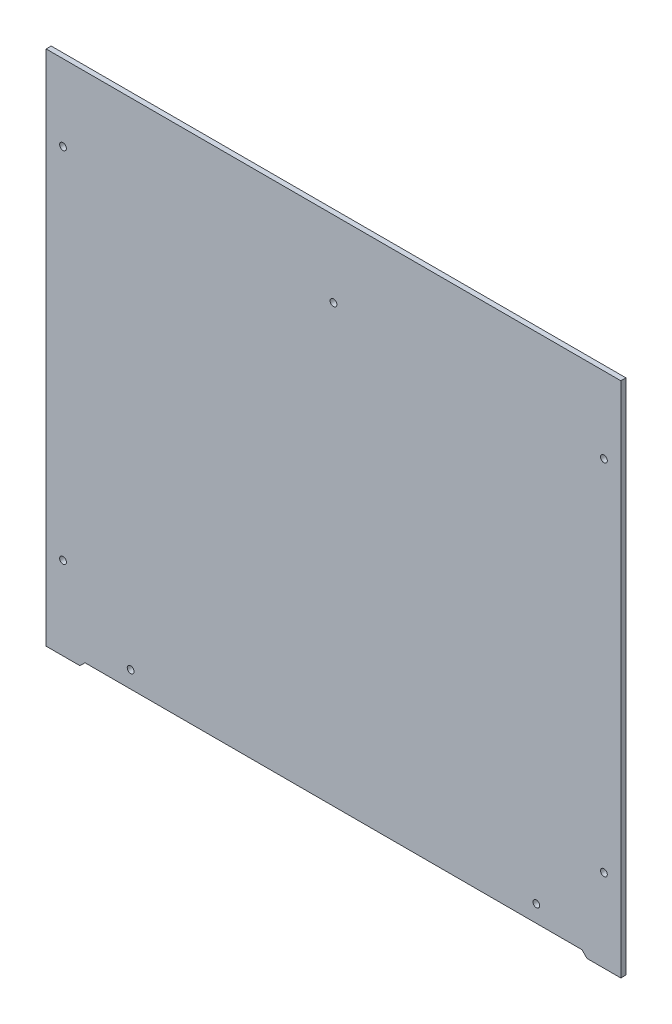
ISO-10303-21;
HEADER;
FILE_DESCRIPTION(('STEP AP214'),'2;1');
FILE_NAME('part.step','',(''),(''),'','','');
FILE_SCHEMA(('AUTOMOTIVE_DESIGN { 1 0 10303 214 1 1 1 1 }'));
ENDSEC;
DATA;
#1=APPLICATION_CONTEXT('core data for automotive mechanical design processes');
#2=APPLICATION_PROTOCOL_DEFINITION('international standard','automotive_design',2000,#1);
#3=PRODUCT_CONTEXT('',#1,'mechanical');
#4=PRODUCT('Part','Part','',(#3));
#5=PRODUCT_RELATED_PRODUCT_CATEGORY('part','',(#4));
#6=PRODUCT_DEFINITION_FORMATION('','',#4);
#7=PRODUCT_DEFINITION_CONTEXT('part definition',#1,'design');
#8=PRODUCT_DEFINITION('design','',#6,#7);
#9=PRODUCT_DEFINITION_SHAPE('','',#8);
#10=(LENGTH_UNIT() NAMED_UNIT(*) SI_UNIT(.MILLI.,.METRE.));
#11=(NAMED_UNIT(*) PLANE_ANGLE_UNIT() SI_UNIT($,.RADIAN.));
#12=(NAMED_UNIT(*) SI_UNIT($,.STERADIAN.) SOLID_ANGLE_UNIT());
#13=UNCERTAINTY_MEASURE_WITH_UNIT(LENGTH_MEASURE(1.E-05),#10,'distance_accuracy_value','');
#14=(GEOMETRIC_REPRESENTATION_CONTEXT(3) GLOBAL_UNCERTAINTY_ASSIGNED_CONTEXT((#13)) GLOBAL_UNIT_ASSIGNED_CONTEXT((#10,
#11,#12)) REPRESENTATION_CONTEXT('',''));
#15=CARTESIAN_POINT('',(0.,0.,0.));
#16=DIRECTION('',(0.,0.,1.));
#17=DIRECTION('',(1.,0.,0.));
#18=AXIS2_PLACEMENT_3D('',#15,#16,#17);
#19=CARTESIAN_POINT('',(0.,151.5,3.));
#20=DIRECTION('',(0.,-1.,0.));
#21=DIRECTION('',(1.,0.,0.));
#22=AXIS2_PLACEMENT_3D('',#19,#20,#21);
#23=PLANE('',#22);
#24=DIRECTION('',(-1.,0.,0.));
#25=VECTOR('',#24,1.);
#26=CARTESIAN_POINT('',(0.,151.5,0.));
#27=LINE('',#26,#25);
#28=CARTESIAN_POINT('',(170.,151.5,0.));
#29=VERTEX_POINT('',#28);
#30=CARTESIAN_POINT('',(-170.,151.5,0.));
#31=VERTEX_POINT('',#30);
#32=EDGE_CURVE('E159',#29,#31,#27,.T.);
#33=ORIENTED_EDGE('',*,*,#32,.T.);
#34=DIRECTION('',(0.,0.,-1.));
#35=VECTOR('',#34,1.);
#36=CARTESIAN_POINT('',(-170.,151.5,3.));
#37=LINE('',#36,#35);
#38=CARTESIAN_POINT('',(-170.,151.5,3.));
#39=VERTEX_POINT('',#38);
#40=EDGE_CURVE('E11',#39,#31,#37,.T.);
#41=ORIENTED_EDGE('',*,*,#40,.F.);
#42=DIRECTION('',(-1.,0.,0.));
#43=VECTOR('',#42,1.);
#44=CARTESIAN_POINT('',(0.,151.5,3.));
#45=LINE('',#44,#43);
#46=CARTESIAN_POINT('',(170.,151.5,3.));
#47=VERTEX_POINT('',#46);
#48=EDGE_CURVE('E211',#47,#39,#45,.T.);
#49=ORIENTED_EDGE('',*,*,#48,.F.);
#50=DIRECTION('',(0.,0.,-1.));
#51=VECTOR('',#50,1.);
#52=CARTESIAN_POINT('',(170.,151.5,3.));
#53=LINE('',#52,#51);
#54=EDGE_CURVE('E57',#47,#29,#53,.T.);
#55=ORIENTED_EDGE('',*,*,#54,.T.);
#56=EDGE_LOOP('',(#33,#41,#49,#55));
#57=FACE_BOUND('',#56,.T.);
#58=ADVANCED_FACE('F40',(#57),#23,.F.);
#59=CARTESIAN_POINT('',(-170.,0.,3.));
#60=DIRECTION('',(1.,0.,0.));
#61=DIRECTION('',(0.,0.,-1.));
#62=AXIS2_PLACEMENT_3D('',#59,#60,#61);
#63=PLANE('',#62);
#64=DIRECTION('',(0.,-1.,0.));
#65=VECTOR('',#64,1.);
#66=CARTESIAN_POINT('',(-170.,0.,0.));
#67=LINE('',#66,#65);
#68=CARTESIAN_POINT('',(-170.,-154.5,0.));
#69=VERTEX_POINT('',#68);
#70=EDGE_CURVE('E161',#31,#69,#67,.T.);
#71=ORIENTED_EDGE('',*,*,#70,.T.);
#72=DIRECTION('',(0.,0.,-1.));
#73=VECTOR('',#72,1.);
#74=CARTESIAN_POINT('',(-170.,-154.5,3.));
#75=LINE('',#74,#73);
#76=CARTESIAN_POINT('',(-170.,-154.5,3.));
#77=VERTEX_POINT('',#76);
#78=EDGE_CURVE('E49',#77,#69,#75,.T.);
#79=ORIENTED_EDGE('',*,*,#78,.F.);
#80=DIRECTION('',(0.,-1.,0.));
#81=VECTOR('',#80,1.);
#82=CARTESIAN_POINT('',(-170.,0.,3.));
#83=LINE('',#82,#81);
#84=EDGE_CURVE('E95',#39,#77,#83,.T.);
#85=ORIENTED_EDGE('',*,*,#84,.F.);
#86=ORIENTED_EDGE('',*,*,#40,.T.);
#87=EDGE_LOOP('',(#71,#79,#85,#86));
#88=FACE_BOUND('',#87,.T.);
#89=ADVANCED_FACE('F196',(#88),#63,.F.);
#90=CARTESIAN_POINT('',(0.,-154.5,3.));
#91=DIRECTION('',(0.,-1.,0.));
#92=DIRECTION('',(0.,0.,-1.));
#93=AXIS2_PLACEMENT_3D('',#90,#91,#92);
#94=PLANE('',#93);
#95=DIRECTION('',(-1.,0.,0.));
#96=VECTOR('',#95,1.);
#97=CARTESIAN_POINT('',(0.,-154.5,0.));
#98=LINE('',#97,#96);
#99=CARTESIAN_POINT('',(-150.,-154.5,0.));
#100=VERTEX_POINT('',#99);
#101=EDGE_CURVE('E165',#100,#69,#98,.T.);
#102=ORIENTED_EDGE('',*,*,#101,.F.);
#103=DIRECTION('',(0.,0.,-1.));
#104=VECTOR('',#103,1.);
#105=CARTESIAN_POINT('',(-150.,-154.5,3.));
#106=LINE('',#105,#104);
#107=CARTESIAN_POINT('',(-150.,-154.5,3.));
#108=VERTEX_POINT('',#107);
#109=EDGE_CURVE('E189',#108,#100,#106,.T.);
#110=ORIENTED_EDGE('',*,*,#109,.F.);
#111=DIRECTION('',(-1.,0.,0.));
#112=VECTOR('',#111,1.);
#113=CARTESIAN_POINT('',(0.,-154.5,3.));
#114=LINE('',#113,#112);
#115=EDGE_CURVE('E195',#108,#77,#114,.T.);
#116=ORIENTED_EDGE('',*,*,#115,.T.);
#117=ORIENTED_EDGE('',*,*,#78,.T.);
#118=EDGE_LOOP('',(#102,#110,#116,#117));
#119=FACE_BOUND('',#118,.T.);
#120=ADVANCED_FACE('F193',(#119),#94,.T.);
#121=CARTESIAN_POINT('',(2.2499999999973,-2.24999999999721,3.));
#122=DIRECTION('',(-0.70710678118656,0.707106781186534,0.));
#123=DIRECTION('',(-0.707106781186534,-0.707106781186561,0.));
#124=AXIS2_PLACEMENT_3D('',#121,#122,#123);
#125=PLANE('',#124);
#126=DIRECTION('',(0.707106781186534,0.707106781186561,0.));
#127=VECTOR('',#126,1.);
#128=CARTESIAN_POINT('',(2.2499999999973,-2.24999999999721,0.));
#129=LINE('',#128,#127);
#130=CARTESIAN_POINT('',(-147.,-151.5,0.));
#131=VERTEX_POINT('',#130);
#132=EDGE_CURVE('E168',#100,#131,#129,.T.);
#133=ORIENTED_EDGE('',*,*,#132,.T.);
#134=DIRECTION('',(0.,0.,-1.));
#135=VECTOR('',#134,1.);
#136=CARTESIAN_POINT('',(-147.,-151.5,3.));
#137=LINE('',#136,#135);
#138=CARTESIAN_POINT('',(-147.,-151.5,3.));
#139=VERTEX_POINT('',#138);
#140=EDGE_CURVE('E187',#139,#131,#137,.T.);
#141=ORIENTED_EDGE('',*,*,#140,.F.);
#142=DIRECTION('',(0.707106781186534,0.707106781186561,0.));
#143=VECTOR('',#142,1.);
#144=CARTESIAN_POINT('',(2.2499999999973,-2.24999999999721,3.));
#145=LINE('',#144,#143);
#146=EDGE_CURVE('E207',#108,#139,#145,.T.);
#147=ORIENTED_EDGE('',*,*,#146,.F.);
#148=ORIENTED_EDGE('',*,*,#109,.T.);
#149=EDGE_LOOP('',(#133,#141,#147,#148));
#150=FACE_BOUND('',#149,.T.);
#151=ADVANCED_FACE('F205',(#150),#125,.F.);
#152=CARTESIAN_POINT('',(0.,-151.5,3.));
#153=DIRECTION('',(0.,-1.,0.));
#154=DIRECTION('',(1.,0.,0.));
#155=AXIS2_PLACEMENT_3D('',#152,#153,#154);
#156=PLANE('',#155);
#157=DIRECTION('',(-1.,0.,0.));
#158=VECTOR('',#157,1.);
#159=CARTESIAN_POINT('',(0.,-151.5,0.));
#160=LINE('',#159,#158);
#161=CARTESIAN_POINT('',(147.,-151.5,0.));
#162=VERTEX_POINT('',#161);
#163=EDGE_CURVE('E171',#162,#131,#160,.T.);
#164=ORIENTED_EDGE('',*,*,#163,.F.);
#165=DIRECTION('',(0.,0.,-1.));
#166=VECTOR('',#165,1.);
#167=CARTESIAN_POINT('',(147.,-151.5,3.));
#168=LINE('',#167,#166);
#169=CARTESIAN_POINT('',(147.,-151.5,3.));
#170=VERTEX_POINT('',#169);
#171=EDGE_CURVE('E120',#170,#162,#168,.T.);
#172=ORIENTED_EDGE('',*,*,#171,.F.);
#173=DIRECTION('',(-1.,0.,0.));
#174=VECTOR('',#173,1.);
#175=CARTESIAN_POINT('',(0.,-151.5,3.));
#176=LINE('',#175,#174);
#177=EDGE_CURVE('E130',#170,#139,#176,.T.);
#178=ORIENTED_EDGE('',*,*,#177,.T.);
#179=ORIENTED_EDGE('',*,*,#140,.T.);
#180=EDGE_LOOP('',(#164,#172,#178,#179));
#181=FACE_BOUND('',#180,.T.);
#182=ADVANCED_FACE('F215',(#181),#156,.T.);
#183=CARTESIAN_POINT('',(-2.25000000000066,-2.25000000000068,3.));
#184=DIRECTION('',(-0.707106781186544,-0.707106781186551,0.));
#185=DIRECTION('',(0.707106781186551,-0.707106781186544,0.));
#186=AXIS2_PLACEMENT_3D('',#183,#184,#185);
#187=PLANE('',#186);
#188=DIRECTION('',(-0.707106781186551,0.707106781186544,0.));
#189=VECTOR('',#188,1.);
#190=CARTESIAN_POINT('',(-2.25000000000066,-2.25000000000068,0.));
#191=LINE('',#190,#189);
#192=CARTESIAN_POINT('',(150.,-154.5,0.));
#193=VERTEX_POINT('',#192);
#194=EDGE_CURVE('E116',#193,#162,#191,.T.);
#195=ORIENTED_EDGE('',*,*,#194,.F.);
#196=DIRECTION('',(0.,0.,-1.));
#197=VECTOR('',#196,1.);
#198=CARTESIAN_POINT('',(150.,-154.5,3.));
#199=LINE('',#198,#197);
#200=CARTESIAN_POINT('',(150.,-154.5,3.));
#201=VERTEX_POINT('',#200);
#202=EDGE_CURVE('E111',#201,#193,#199,.T.);
#203=ORIENTED_EDGE('',*,*,#202,.F.);
#204=DIRECTION('',(-0.707106781186551,0.707106781186544,0.));
#205=VECTOR('',#204,1.);
#206=CARTESIAN_POINT('',(-2.25000000000066,-2.25000000000068,3.));
#207=LINE('',#206,#205);
#208=EDGE_CURVE('E114',#201,#170,#207,.T.);
#209=ORIENTED_EDGE('',*,*,#208,.T.);
#210=ORIENTED_EDGE('',*,*,#171,.T.);
#211=EDGE_LOOP('',(#195,#203,#209,#210));
#212=FACE_BOUND('',#211,.T.);
#213=ADVANCED_FACE('F113',(#212),#187,.T.);
#214=CARTESIAN_POINT('',(0.,-154.5,3.));
#215=DIRECTION('',(0.,-1.,0.));
#216=DIRECTION('',(0.,0.,-1.));
#217=AXIS2_PLACEMENT_3D('',#214,#215,#216);
#218=PLANE('',#217);
#219=DIRECTION('',(-1.,0.,0.));
#220=VECTOR('',#219,1.);
#221=CARTESIAN_POINT('',(0.,-154.5,0.));
#222=LINE('',#221,#220);
#223=CARTESIAN_POINT('',(170.,-154.5,0.));
#224=VERTEX_POINT('',#223);
#225=EDGE_CURVE('E175',#224,#193,#222,.T.);
#226=ORIENTED_EDGE('',*,*,#225,.F.);
#227=DIRECTION('',(0.,0.,-1.));
#228=VECTOR('',#227,1.);
#229=CARTESIAN_POINT('',(170.,-154.5,3.));
#230=LINE('',#229,#228);
#231=CARTESIAN_POINT('',(170.,-154.5,3.));
#232=VERTEX_POINT('',#231);
#233=EDGE_CURVE('E83',#232,#224,#230,.T.);
#234=ORIENTED_EDGE('',*,*,#233,.F.);
#235=DIRECTION('',(-1.,0.,0.));
#236=VECTOR('',#235,1.);
#237=CARTESIAN_POINT('',(0.,-154.5,3.));
#238=LINE('',#237,#236);
#239=EDGE_CURVE('E128',#232,#201,#238,.T.);
#240=ORIENTED_EDGE('',*,*,#239,.T.);
#241=ORIENTED_EDGE('',*,*,#202,.T.);
#242=EDGE_LOOP('',(#226,#234,#240,#241));
#243=FACE_BOUND('',#242,.T.);
#244=ADVANCED_FACE('F132',(#243),#218,.T.);
#245=CARTESIAN_POINT('',(170.,0.,3.));
#246=DIRECTION('',(1.,0.,0.));
#247=DIRECTION('',(0.,0.,-1.));
#248=AXIS2_PLACEMENT_3D('',#245,#246,#247);
#249=PLANE('',#248);
#250=DIRECTION('',(0.,-1.,0.));
#251=VECTOR('',#250,1.);
#252=CARTESIAN_POINT('',(170.,0.,0.));
#253=LINE('',#252,#251);
#254=EDGE_CURVE('E177',#29,#224,#253,.T.);
#255=ORIENTED_EDGE('',*,*,#254,.F.);
#256=ORIENTED_EDGE('',*,*,#54,.F.);
#257=DIRECTION('',(0.,-1.,0.));
#258=VECTOR('',#257,1.);
#259=CARTESIAN_POINT('',(170.,0.,3.));
#260=LINE('',#259,#258);
#261=EDGE_CURVE('E133',#47,#232,#260,.T.);
#262=ORIENTED_EDGE('',*,*,#261,.T.);
#263=ORIENTED_EDGE('',*,*,#233,.T.);
#264=EDGE_LOOP('',(#255,#256,#262,#263));
#265=FACE_BOUND('',#264,.T.);
#266=ADVANCED_FACE('F216',(#265),#249,.T.);
#267=CARTESIAN_POINT('',(-120.,-141.5,3.));
#268=DIRECTION('',(0.,0.,-1.));
#269=DIRECTION('',(-1.,0.,0.));
#270=AXIS2_PLACEMENT_3D('',#267,#268,#269);
#271=CYLINDRICAL_SURFACE('',#270,2.);
#272=CARTESIAN_POINT('',(-120.,-141.5,3.));
#273=DIRECTION('',(0.,0.,1.));
#274=DIRECTION('',(1.,0.,0.));
#275=AXIS2_PLACEMENT_3D('',#272,#273,#274);
#276=CIRCLE('',#275,2.);
#277=CARTESIAN_POINT('',(-118.,-141.5,3.));
#278=VERTEX_POINT('',#277);
#279=EDGE_CURVE('E460',#278,#278,#276,.T.);
#280=ORIENTED_EDGE('',*,*,#279,.T.);
#281=EDGE_LOOP('',(#280));
#282=FACE_BOUND('',#281,.T.);
#283=CARTESIAN_POINT('',(-120.,-141.5,0.));
#284=DIRECTION('',(0.,0.,1.));
#285=DIRECTION('',(1.,0.,0.));
#286=AXIS2_PLACEMENT_3D('',#283,#284,#285);
#287=CIRCLE('',#286,2.);
#288=CARTESIAN_POINT('',(-118.,-141.5,0.));
#289=VERTEX_POINT('',#288);
#290=EDGE_CURVE('E156',#289,#289,#287,.T.);
#291=ORIENTED_EDGE('',*,*,#290,.F.);
#292=EDGE_LOOP('',(#291));
#293=FACE_BOUND('',#292,.T.);
#294=ADVANCED_FACE('F218',(#282,#293),#271,.F.);
#295=CARTESIAN_POINT('',(120.,-141.5,3.));
#296=DIRECTION('',(0.,0.,-1.));
#297=DIRECTION('',(-1.,0.,0.));
#298=AXIS2_PLACEMENT_3D('',#295,#296,#297);
#299=CYLINDRICAL_SURFACE('',#298,2.);
#300=CARTESIAN_POINT('',(120.,-141.5,3.));
#301=DIRECTION('',(0.,0.,1.));
#302=DIRECTION('',(1.,0.,0.));
#303=AXIS2_PLACEMENT_3D('',#300,#301,#302);
#304=CIRCLE('',#303,2.);
#305=CARTESIAN_POINT('',(122.,-141.5,3.));
#306=VERTEX_POINT('',#305);
#307=EDGE_CURVE('E457',#306,#306,#304,.T.);
#308=ORIENTED_EDGE('',*,*,#307,.T.);
#309=EDGE_LOOP('',(#308));
#310=FACE_BOUND('',#309,.T.);
#311=CARTESIAN_POINT('',(120.,-141.5,0.));
#312=DIRECTION('',(0.,0.,1.));
#313=DIRECTION('',(1.,0.,0.));
#314=AXIS2_PLACEMENT_3D('',#311,#312,#313);
#315=CIRCLE('',#314,2.);
#316=CARTESIAN_POINT('',(122.,-141.5,0.));
#317=VERTEX_POINT('',#316);
#318=EDGE_CURVE('E153',#317,#317,#315,.T.);
#319=ORIENTED_EDGE('',*,*,#318,.F.);
#320=EDGE_LOOP('',(#319));
#321=FACE_BOUND('',#320,.T.);
#322=ADVANCED_FACE('F224',(#310,#321),#299,.F.);
#323=CARTESIAN_POINT('',(-160.,106.5,3.));
#324=DIRECTION('',(0.,0.,-1.));
#325=DIRECTION('',(-1.,0.,0.));
#326=AXIS2_PLACEMENT_3D('',#323,#324,#325);
#327=CYLINDRICAL_SURFACE('',#326,2.);
#328=CARTESIAN_POINT('',(-160.,106.5,3.));
#329=DIRECTION('',(0.,0.,1.));
#330=DIRECTION('',(1.,0.,0.));
#331=AXIS2_PLACEMENT_3D('',#328,#329,#330);
#332=CIRCLE('',#331,2.);
#333=CARTESIAN_POINT('',(-158.,106.5,3.));
#334=VERTEX_POINT('',#333);
#335=EDGE_CURVE('E453',#334,#334,#332,.T.);
#336=ORIENTED_EDGE('',*,*,#335,.T.);
#337=EDGE_LOOP('',(#336));
#338=FACE_BOUND('',#337,.T.);
#339=CARTESIAN_POINT('',(-160.,106.5,0.));
#340=DIRECTION('',(0.,0.,1.));
#341=DIRECTION('',(1.,0.,0.));
#342=AXIS2_PLACEMENT_3D('',#339,#340,#341);
#343=CIRCLE('',#342,2.);
#344=CARTESIAN_POINT('',(-158.,106.5,0.));
#345=VERTEX_POINT('',#344);
#346=EDGE_CURVE('E150',#345,#345,#343,.T.);
#347=ORIENTED_EDGE('',*,*,#346,.F.);
#348=EDGE_LOOP('',(#347));
#349=FACE_BOUND('',#348,.T.);
#350=ADVANCED_FACE('F239',(#338,#349),#327,.F.);
#351=CARTESIAN_POINT('',(-160.,-105.5,3.));
#352=DIRECTION('',(0.,0.,-1.));
#353=DIRECTION('',(-1.,0.,0.));
#354=AXIS2_PLACEMENT_3D('',#351,#352,#353);
#355=CYLINDRICAL_SURFACE('',#354,2.);
#356=CARTESIAN_POINT('',(-160.,-105.5,3.));
#357=DIRECTION('',(0.,0.,1.));
#358=DIRECTION('',(1.,0.,0.));
#359=AXIS2_PLACEMENT_3D('',#356,#357,#358);
#360=CIRCLE('',#359,2.);
#361=CARTESIAN_POINT('',(-158.,-105.5,3.));
#362=VERTEX_POINT('',#361);
#363=EDGE_CURVE('E449',#362,#362,#360,.T.);
#364=ORIENTED_EDGE('',*,*,#363,.T.);
#365=EDGE_LOOP('',(#364));
#366=FACE_BOUND('',#365,.T.);
#367=CARTESIAN_POINT('',(-160.,-105.5,0.));
#368=DIRECTION('',(0.,0.,1.));
#369=DIRECTION('',(1.,0.,0.));
#370=AXIS2_PLACEMENT_3D('',#367,#368,#369);
#371=CIRCLE('',#370,2.);
#372=CARTESIAN_POINT('',(-158.,-105.5,0.));
#373=VERTEX_POINT('',#372);
#374=EDGE_CURVE('E147',#373,#373,#371,.T.);
#375=ORIENTED_EDGE('',*,*,#374,.F.);
#376=EDGE_LOOP('',(#375));
#377=FACE_BOUND('',#376,.T.);
#378=ADVANCED_FACE('F243',(#366,#377),#355,.F.);
#379=CARTESIAN_POINT('',(160.,106.5,3.));
#380=DIRECTION('',(0.,0.,-1.));
#381=DIRECTION('',(-1.,0.,0.));
#382=AXIS2_PLACEMENT_3D('',#379,#380,#381);
#383=CYLINDRICAL_SURFACE('',#382,2.);
#384=CARTESIAN_POINT('',(160.,106.5,3.));
#385=DIRECTION('',(0.,0.,1.));
#386=DIRECTION('',(1.,0.,0.));
#387=AXIS2_PLACEMENT_3D('',#384,#385,#386);
#388=CIRCLE('',#387,2.);
#389=CARTESIAN_POINT('',(162.,106.5,3.));
#390=VERTEX_POINT('',#389);
#391=EDGE_CURVE('E258',#390,#390,#388,.T.);
#392=ORIENTED_EDGE('',*,*,#391,.T.);
#393=EDGE_LOOP('',(#392));
#394=FACE_BOUND('',#393,.T.);
#395=CARTESIAN_POINT('',(160.,106.5,0.));
#396=DIRECTION('',(0.,0.,1.));
#397=DIRECTION('',(1.,0.,0.));
#398=AXIS2_PLACEMENT_3D('',#395,#396,#397);
#399=CIRCLE('',#398,2.);
#400=CARTESIAN_POINT('',(162.,106.5,0.));
#401=VERTEX_POINT('',#400);
#402=EDGE_CURVE('E144',#401,#401,#399,.T.);
#403=ORIENTED_EDGE('',*,*,#402,.F.);
#404=EDGE_LOOP('',(#403));
#405=FACE_BOUND('',#404,.T.);
#406=ADVANCED_FACE('F246',(#394,#405),#383,.F.);
#407=CARTESIAN_POINT('',(160.,-105.5,3.));
#408=DIRECTION('',(0.,0.,-1.));
#409=DIRECTION('',(-1.,0.,0.));
#410=AXIS2_PLACEMENT_3D('',#407,#408,#409);
#411=CYLINDRICAL_SURFACE('',#410,2.);
#412=CARTESIAN_POINT('',(160.,-105.5,3.));
#413=DIRECTION('',(0.,0.,1.));
#414=DIRECTION('',(1.,0.,0.));
#415=AXIS2_PLACEMENT_3D('',#412,#413,#414);
#416=CIRCLE('',#415,2.);
#417=CARTESIAN_POINT('',(162.,-105.5,3.));
#418=VERTEX_POINT('',#417);
#419=EDGE_CURVE('E183',#418,#418,#416,.T.);
#420=ORIENTED_EDGE('',*,*,#419,.T.);
#421=EDGE_LOOP('',(#420));
#422=FACE_BOUND('',#421,.T.);
#423=CARTESIAN_POINT('',(160.,-105.5,0.));
#424=DIRECTION('',(0.,0.,1.));
#425=DIRECTION('',(1.,0.,0.));
#426=AXIS2_PLACEMENT_3D('',#423,#424,#425);
#427=CIRCLE('',#426,2.);
#428=CARTESIAN_POINT('',(162.,-105.5,0.));
#429=VERTEX_POINT('',#428);
#430=EDGE_CURVE('E141',#429,#429,#427,.T.);
#431=ORIENTED_EDGE('',*,*,#430,.F.);
#432=EDGE_LOOP('',(#431));
#433=FACE_BOUND('',#432,.T.);
#434=ADVANCED_FACE('F42',(#422,#433),#411,.F.);
#435=CARTESIAN_POINT('',(0.,106.5,3.));
#436=DIRECTION('',(0.,0.,-1.));
#437=DIRECTION('',(-1.,0.,0.));
#438=AXIS2_PLACEMENT_3D('',#435,#436,#437);
#439=CYLINDRICAL_SURFACE('',#438,2.);
#440=CARTESIAN_POINT('',(0.,106.5,3.));
#441=DIRECTION('',(0.,0.,1.));
#442=DIRECTION('',(1.,0.,0.));
#443=AXIS2_PLACEMENT_3D('',#440,#441,#442);
#444=CIRCLE('',#443,2.);
#445=CARTESIAN_POINT('',(2.,106.5,3.));
#446=VERTEX_POINT('',#445);
#447=EDGE_CURVE('E135',#446,#446,#444,.T.);
#448=ORIENTED_EDGE('',*,*,#447,.T.);
#449=EDGE_LOOP('',(#448));
#450=FACE_BOUND('',#449,.T.);
#451=CARTESIAN_POINT('',(0.,106.5,0.));
#452=DIRECTION('',(0.,0.,1.));
#453=DIRECTION('',(1.,0.,0.));
#454=AXIS2_PLACEMENT_3D('',#451,#452,#453);
#455=CIRCLE('',#454,2.);
#456=CARTESIAN_POINT('',(2.,106.5,0.));
#457=VERTEX_POINT('',#456);
#458=EDGE_CURVE('E180',#457,#457,#455,.T.);
#459=ORIENTED_EDGE('',*,*,#458,.F.);
#460=EDGE_LOOP('',(#459));
#461=FACE_BOUND('',#460,.T.);
#462=ADVANCED_FACE('F253',(#450,#461),#439,.F.);
#463=CARTESIAN_POINT('',(0.,0.,3.));
#464=DIRECTION('',(0.,0.,1.));
#465=DIRECTION('',(1.,0.,0.));
#466=AXIS2_PLACEMENT_3D('',#463,#464,#465);
#467=PLANE('',#466);
#468=ORIENTED_EDGE('',*,*,#419,.F.);
#469=EDGE_LOOP('',(#468));
#470=FACE_BOUND('',#469,.T.);
#471=ORIENTED_EDGE('',*,*,#391,.F.);
#472=EDGE_LOOP('',(#471));
#473=FACE_BOUND('',#472,.T.);
#474=ORIENTED_EDGE('',*,*,#363,.F.);
#475=EDGE_LOOP('',(#474));
#476=FACE_BOUND('',#475,.T.);
#477=ORIENTED_EDGE('',*,*,#335,.F.);
#478=EDGE_LOOP('',(#477));
#479=FACE_BOUND('',#478,.T.);
#480=ORIENTED_EDGE('',*,*,#307,.F.);
#481=EDGE_LOOP('',(#480));
#482=FACE_BOUND('',#481,.T.);
#483=ORIENTED_EDGE('',*,*,#279,.F.);
#484=EDGE_LOOP('',(#483));
#485=FACE_BOUND('',#484,.T.);
#486=ORIENTED_EDGE('',*,*,#48,.T.);
#487=ORIENTED_EDGE('',*,*,#84,.T.);
#488=ORIENTED_EDGE('',*,*,#115,.F.);
#489=ORIENTED_EDGE('',*,*,#146,.T.);
#490=ORIENTED_EDGE('',*,*,#177,.F.);
#491=ORIENTED_EDGE('',*,*,#208,.F.);
#492=ORIENTED_EDGE('',*,*,#239,.F.);
#493=ORIENTED_EDGE('',*,*,#261,.F.);
#494=EDGE_LOOP('',(#486,#487,#488,#489,#490,#491,#492,#493));
#495=FACE_BOUND('',#494,.T.);
#496=ORIENTED_EDGE('',*,*,#447,.F.);
#497=EDGE_LOOP('',(#496));
#498=FACE_BOUND('',#497,.T.);
#499=ADVANCED_FACE('F125',(#470,#473,#476,#479,#482,#485,#495,#498),#467,.T.);
#500=CARTESIAN_POINT('',(0.,0.,0.));
#501=DIRECTION('',(0.,0.,1.));
#502=DIRECTION('',(1.,0.,0.));
#503=AXIS2_PLACEMENT_3D('',#500,#501,#502);
#504=PLANE('',#503);
#505=ORIENTED_EDGE('',*,*,#430,.T.);
#506=EDGE_LOOP('',(#505));
#507=FACE_BOUND('',#506,.T.);
#508=ORIENTED_EDGE('',*,*,#402,.T.);
#509=EDGE_LOOP('',(#508));
#510=FACE_BOUND('',#509,.T.);
#511=ORIENTED_EDGE('',*,*,#374,.T.);
#512=EDGE_LOOP('',(#511));
#513=FACE_BOUND('',#512,.T.);
#514=ORIENTED_EDGE('',*,*,#346,.T.);
#515=EDGE_LOOP('',(#514));
#516=FACE_BOUND('',#515,.T.);
#517=ORIENTED_EDGE('',*,*,#318,.T.);
#518=EDGE_LOOP('',(#517));
#519=FACE_BOUND('',#518,.T.);
#520=ORIENTED_EDGE('',*,*,#290,.T.);
#521=EDGE_LOOP('',(#520));
#522=FACE_BOUND('',#521,.T.);
#523=ORIENTED_EDGE('',*,*,#32,.F.);
#524=ORIENTED_EDGE('',*,*,#254,.T.);
#525=ORIENTED_EDGE('',*,*,#225,.T.);
#526=ORIENTED_EDGE('',*,*,#194,.T.);
#527=ORIENTED_EDGE('',*,*,#163,.T.);
#528=ORIENTED_EDGE('',*,*,#132,.F.);
#529=ORIENTED_EDGE('',*,*,#101,.T.);
#530=ORIENTED_EDGE('',*,*,#70,.F.);
#531=EDGE_LOOP('',(#523,#524,#525,#526,#527,#528,#529,#530));
#532=FACE_BOUND('',#531,.T.);
#533=ORIENTED_EDGE('',*,*,#458,.T.);
#534=EDGE_LOOP('',(#533));
#535=FACE_BOUND('',#534,.T.);
#536=ADVANCED_FACE('F200',(#507,#510,#513,#516,#519,#522,#532,#535),#504,.F.);
#537=CLOSED_SHELL('',(#58,#89,#120,#151,#182,#213,#244,#266,#294,#322,#350,#378,#406,#434,#462,
#499,#536));
#538=MANIFOLD_SOLID_BREP('B2',#537);
#539=ADVANCED_BREP_SHAPE_REPRESENTATION('',(#18,#538),#14);
#540=SHAPE_DEFINITION_REPRESENTATION(#9,#539);
ENDSEC;
END-ISO-10303-21;
